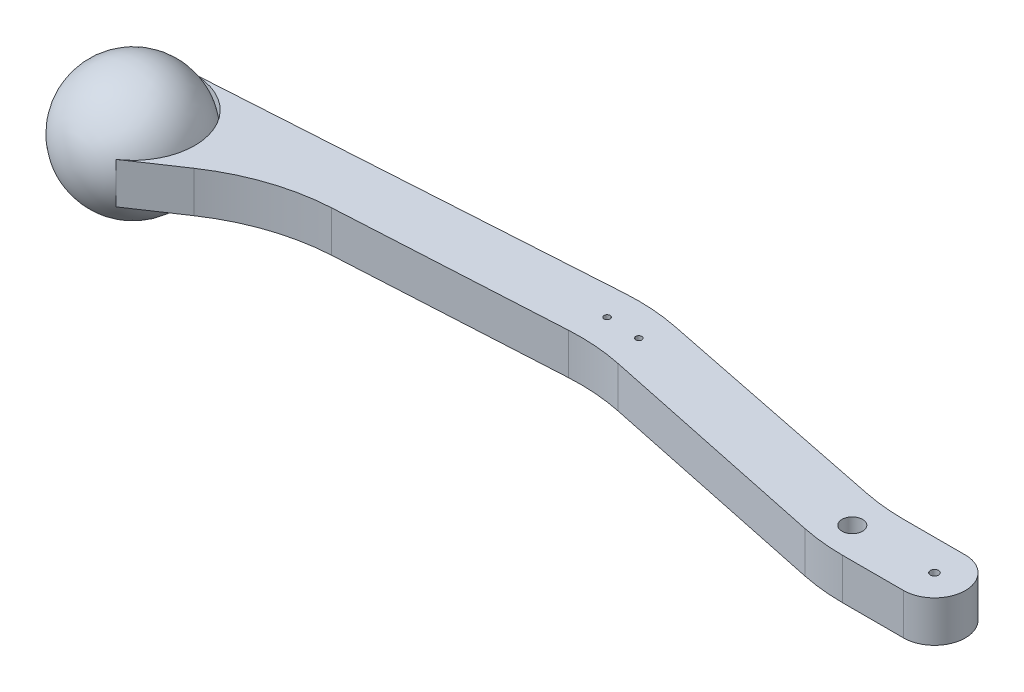
ISO-10303-21;
HEADER;
FILE_DESCRIPTION(('STEP AP214'),'2;1');
FILE_NAME('part.step','',(''),(''),'','','');
FILE_SCHEMA(('AUTOMOTIVE_DESIGN { 1 0 10303 214 1 1 1 1 }'));
ENDSEC;
DATA;
#1=APPLICATION_CONTEXT('core data for automotive mechanical design processes');
#2=APPLICATION_PROTOCOL_DEFINITION('international standard','automotive_design',2000,#1);
#3=PRODUCT_CONTEXT('',#1,'mechanical');
#4=PRODUCT('Part','Part','',(#3));
#5=PRODUCT_RELATED_PRODUCT_CATEGORY('part','',(#4));
#6=PRODUCT_DEFINITION_FORMATION('','',#4);
#7=PRODUCT_DEFINITION_CONTEXT('part definition',#1,'design');
#8=PRODUCT_DEFINITION('design','',#6,#7);
#9=PRODUCT_DEFINITION_SHAPE('','',#8);
#10=(LENGTH_UNIT() NAMED_UNIT(*) SI_UNIT(.MILLI.,.METRE.));
#11=(NAMED_UNIT(*) PLANE_ANGLE_UNIT() SI_UNIT($,.RADIAN.));
#12=(NAMED_UNIT(*) SI_UNIT($,.STERADIAN.) SOLID_ANGLE_UNIT());
#13=UNCERTAINTY_MEASURE_WITH_UNIT(LENGTH_MEASURE(1.E-05),#10,'distance_accuracy_value','');
#14=(GEOMETRIC_REPRESENTATION_CONTEXT(3) GLOBAL_UNCERTAINTY_ASSIGNED_CONTEXT((#13)) GLOBAL_UNIT_ASSIGNED_CONTEXT((#10,
#11,#12)) REPRESENTATION_CONTEXT('',''));
#15=CARTESIAN_POINT('',(0.,0.,0.));
#16=DIRECTION('',(0.,0.,1.));
#17=DIRECTION('',(1.,0.,0.));
#18=AXIS2_PLACEMENT_3D('',#15,#16,#17);
#19=CARTESIAN_POINT('',(-350.,0.,0.));
#20=DIRECTION('',(0.,0.,-1.));
#21=DIRECTION('',(1.,0.,0.));
#22=AXIS2_PLACEMENT_3D('',#19,#20,#21);
#23=SPHERICAL_SURFACE('',#22,30.);
#24=CARTESIAN_POINT('',(-350.,0.,-30.));
#25=VERTEX_POINT('',#24);
#26=VERTEX_LOOP('',#25);
#27=FACE_BOUND('',#26,.T.);
#28=ADVANCED_FACE('F43',(#27),#23,.T.);
#29=CLOSED_SHELL('',(#28));
#30=MANIFOLD_SOLID_BREP('B2',#29);
#31=CARTESIAN_POINT('',(0.,-10.,0.));
#32=DIRECTION('',(0.,1.,0.));
#33=DIRECTION('',(0.,0.,1.));
#34=AXIS2_PLACEMENT_3D('',#31,#32,#33);
#35=PLANE('',#34);
#36=CARTESIAN_POINT('',(40.,-10.,0.));
#37=DIRECTION('',(0.,1.,0.));
#38=DIRECTION('',(0.,0.,1.));
#39=AXIS2_PLACEMENT_3D('',#36,#37,#38);
#40=CIRCLE('',#39,2.);
#41=CARTESIAN_POINT('',(40.,-10.,2.));
#42=VERTEX_POINT('',#41);
#43=EDGE_CURVE('E217',#42,#42,#40,.T.);
#44=ORIENTED_EDGE('',*,*,#43,.T.);
#45=EDGE_LOOP('',(#44));
#46=FACE_BOUND('',#45,.T.);
#47=CARTESIAN_POINT('',(0.,-10.,0.));
#48=DIRECTION('',(0.,1.,0.));
#49=DIRECTION('',(0.,0.,1.));
#50=AXIS2_PLACEMENT_3D('',#47,#48,#49);
#51=CIRCLE('',#50,5.);
#52=CARTESIAN_POINT('',(0.,-10.,5.));
#53=VERTEX_POINT('',#52);
#54=EDGE_CURVE('E214',#53,#53,#51,.T.);
#55=ORIENTED_EDGE('',*,*,#54,.T.);
#56=EDGE_LOOP('',(#55));
#57=FACE_BOUND('',#56,.T.);
#58=CARTESIAN_POINT('',(-350.,-10.,0.));
#59=DIRECTION('',(0.,1.,0.));
#60=DIRECTION('',(0.,0.,1.));
#61=AXIS2_PLACEMENT_3D('',#58,#59,#60);
#62=CIRCLE('',#61,30.0000000000001);
#63=CARTESIAN_POINT('',(-333.28573951652,-10.,24.9125168638253));
#64=VERTEX_POINT('',#63);
#65=CARTESIAN_POINT('',(-351.875417006676,-10.,-29.9413228006224));
#66=VERTEX_POINT('',#65);
#67=EDGE_CURVE('E179',#64,#66,#62,.T.);
#68=ORIENTED_EDGE('',*,*,#67,.T.);
#69=DIRECTION('',(-0.998044093354079,0.,0.0625139002225495));
#70=VECTOR('',#69,1.);
#71=CARTESIAN_POINT('',(-3.24321270903869,-10.,-51.778392904997));
#72=LINE('',#71,#70);
#73=CARTESIAN_POINT('',(-152.924441108368,-10.,-42.4028979347315));
#74=VERTEX_POINT('',#73);
#75=EDGE_CURVE('E164',#74,#66,#72,.T.);
#76=ORIENTED_EDGE('',*,*,#75,.F.);
#77=CARTESIAN_POINT('',(-146.673051086113,-10.,57.4015114006764));
#78=DIRECTION('',(0.,1.,0.));
#79=DIRECTION('',(0.,0.,1.));
#80=AXIS2_PLACEMENT_3D('',#77,#78,#79);
#81=CIRCLE('',#80,100.);
#82=CARTESIAN_POINT('',(-126.880148237604,-10.,-40.6201239500433));
#83=VERTEX_POINT('',#82);
#84=EDGE_CURVE('E235',#74,#83,#81,.F.);
#85=ORIENTED_EDGE('',*,*,#84,.T.);
#86=DIRECTION('',(-0.980216353507197,0.,-0.197929028485096));
#87=VECTOR('',#86,1.);
#88=CARTESIAN_POINT('',(2.91019905832324,-10.,-14.4123614952442));
#89=LINE('',#88,#87);
#90=CARTESIAN_POINT('',(-9.79757945192511,-10.,-16.9783646492803));
#91=VERTEX_POINT('',#90);
#92=EDGE_CURVE('E210',#91,#83,#89,.T.);
#93=ORIENTED_EDGE('',*,*,#92,.F.);
#94=CARTESIAN_POINT('',(9.99532339658448,-10.,-115.));
#95=DIRECTION('',(0.,1.,0.));
#96=DIRECTION('',(0.,0.,1.));
#97=AXIS2_PLACEMENT_3D('',#94,#95,#96);
#98=CIRCLE('',#97,100.);
#99=CARTESIAN_POINT('',(9.99532339658448,-10.,-15.));
#100=VERTEX_POINT('',#99);
#101=EDGE_CURVE('E259',#91,#100,#98,.T.);
#102=ORIENTED_EDGE('',*,*,#101,.T.);
#103=DIRECTION('',(1.,0.,0.));
#104=VECTOR('',#103,1.);
#105=CARTESIAN_POINT('',(0.,-10.,-15.));
#106=LINE('',#105,#104);
#107=CARTESIAN_POINT('',(40.,-10.,-15.));
#108=VERTEX_POINT('',#107);
#109=EDGE_CURVE('E208',#100,#108,#106,.T.);
#110=ORIENTED_EDGE('',*,*,#109,.T.);
#111=CARTESIAN_POINT('',(40.,-10.,0.));
#112=DIRECTION('',(0.,1.,0.));
#113=DIRECTION('',(0.,0.,1.));
#114=AXIS2_PLACEMENT_3D('',#111,#112,#113);
#115=CIRCLE('',#114,15.);
#116=CARTESIAN_POINT('',(40.,-10.,15.));
#117=VERTEX_POINT('',#116);
#118=EDGE_CURVE('E205',#117,#108,#115,.T.);
#119=ORIENTED_EDGE('',*,*,#118,.F.);
#120=DIRECTION('',(1.,0.,0.));
#121=VECTOR('',#120,1.);
#122=CARTESIAN_POINT('',(0.,-10.,15.));
#123=LINE('',#122,#121);
#124=CARTESIAN_POINT('',(10.2526447189393,-10.,15.));
#125=VERTEX_POINT('',#124);
#126=EDGE_CURVE('E203',#125,#117,#123,.T.);
#127=ORIENTED_EDGE('',*,*,#126,.F.);
#128=CARTESIAN_POINT('',(10.2526447189393,-10.,-85.));
#129=DIRECTION('',(0.,1.,0.));
#130=DIRECTION('',(0.,0.,1.));
#131=AXIS2_PLACEMENT_3D('',#128,#129,#130);
#132=CIRCLE('',#131,100.);
#133=CARTESIAN_POINT('',(-10.2447746944077,-10.,12.8767377745772));
#134=VERTEX_POINT('',#133);
#135=EDGE_CURVE('E237',#125,#134,#132,.F.);
#136=ORIENTED_EDGE('',*,*,#135,.T.);
#137=DIRECTION('',(0.978767377745772,0.,0.20497419413347));
#138=VECTOR('',#137,1.);
#139=CARTESIAN_POINT('',(-3.01378585704881,-10.,14.3910568491865));
#140=LINE('',#139,#138);
#141=CARTESIAN_POINT('',(-125.16756201185,-10.,-11.1904780456087));
#142=VERTEX_POINT('',#141);
#143=EDGE_CURVE('E200',#142,#134,#140,.T.);
#144=ORIENTED_EDGE('',*,*,#143,.F.);
#145=CARTESIAN_POINT('',(-145.664981425197,-10.,86.6862597289684));
#146=DIRECTION('',(0.,1.,0.));
#147=DIRECTION('',(0.,0.,1.));
#148=AXIS2_PLACEMENT_3D('',#145,#146,#147);
#149=CIRCLE('',#148,100.);
#150=CARTESIAN_POINT('',(-151.198358450132,-10.,-13.1605316000468));
#151=VERTEX_POINT('',#150);
#152=EDGE_CURVE('E75',#142,#151,#149,.T.);
#153=ORIENTED_EDGE('',*,*,#152,.T.);
#154=DIRECTION('',(0.998467913290153,0.,-0.0553337702493512));
#155=VECTOR('',#154,1.);
#156=CARTESIAN_POINT('',(-1.19004921764275,-10.,-21.4737935567704));
#157=LINE('',#156,#155);
#158=CARTESIAN_POINT('',(-260.427572141376,-10.,-7.1071931457422));
#159=VERTEX_POINT('',#158);
#160=EDGE_CURVE('E198',#159,#151,#157,.T.);
#161=ORIENTED_EDGE('',*,*,#160,.F.);
#162=CARTESIAN_POINT('',(-254.894195116441,-10.,92.7395981832731));
#163=DIRECTION('',(0.,1.,0.));
#164=DIRECTION('',(0.,0.,1.));
#165=AXIS2_PLACEMENT_3D('',#162,#163,#164);
#166=CIRCLE('',#165,100.);
#167=CARTESIAN_POINT('',(-310.608396728041,-10.,9.69787530385566));
#168=VERTEX_POINT('',#167);
#169=EDGE_CURVE('E41',#159,#168,#166,.T.);
#170=ORIENTED_EDGE('',*,*,#169,.T.);
#171=DIRECTION('',(0.830417228794175,0.,-0.557142016116002));
#172=VECTOR('',#171,1.);
#173=CARTESIAN_POINT('',(-91.9282686591511,-10.,-137.018598309922));
#174=LINE('',#173,#172);
#175=EDGE_CURVE('E196',#64,#168,#174,.T.);
#176=ORIENTED_EDGE('',*,*,#175,.F.);
#177=EDGE_LOOP('',(#68,#76,#85,#93,#102,#110,#119,#127,#136,#144,#153,#161,#170,#176));
#178=FACE_BOUND('',#177,.T.);
#179=ADVANCED_FACE('F56',(#46,#57,#178),#35,.F.);
#180=CARTESIAN_POINT('',(0.,10.,0.));
#181=DIRECTION('',(0.,1.,0.));
#182=DIRECTION('',(0.,0.,1.));
#183=AXIS2_PLACEMENT_3D('',#180,#181,#182);
#184=PLANE('',#183);
#185=CARTESIAN_POINT('',(40.,10.,0.));
#186=DIRECTION('',(0.,1.,0.));
#187=DIRECTION('',(0.,0.,1.));
#188=AXIS2_PLACEMENT_3D('',#185,#186,#187);
#189=CIRCLE('',#188,2.);
#190=CARTESIAN_POINT('',(40.,10.,2.));
#191=VERTEX_POINT('',#190);
#192=EDGE_CURVE('E188',#191,#191,#189,.T.);
#193=ORIENTED_EDGE('',*,*,#192,.F.);
#194=EDGE_LOOP('',(#193));
#195=FACE_BOUND('',#194,.T.);
#196=CARTESIAN_POINT('',(0.,10.,0.));
#197=DIRECTION('',(0.,1.,0.));
#198=DIRECTION('',(0.,0.,1.));
#199=AXIS2_PLACEMENT_3D('',#196,#197,#198);
#200=CIRCLE('',#199,5.);
#201=CARTESIAN_POINT('',(0.,10.,5.));
#202=VERTEX_POINT('',#201);
#203=EDGE_CURVE('E184',#202,#202,#200,.T.);
#204=ORIENTED_EDGE('',*,*,#203,.F.);
#205=EDGE_LOOP('',(#204));
#206=FACE_BOUND('',#205,.T.);
#207=CARTESIAN_POINT('',(-147.33624692302,10.,-28.0506034789789));
#208=DIRECTION('',(0.,1.,0.));
#209=DIRECTION('',(0.,0.,1.));
#210=AXIS2_PLACEMENT_3D('',#207,#208,#209);
#211=CIRCLE('',#210,1.5);
#212=CARTESIAN_POINT('',(-147.33624692302,10.,-26.5506034789789));
#213=VERTEX_POINT('',#212);
#214=EDGE_CURVE('E283',#213,#213,#211,.T.);
#215=ORIENTED_EDGE('',*,*,#214,.F.);
#216=EDGE_LOOP('',(#215));
#217=FACE_BOUND('',#216,.T.);
#218=CARTESIAN_POINT('',(-130.791911052962,10.,-26.905656844259));
#219=DIRECTION('',(0.,1.,0.));
#220=DIRECTION('',(0.,0.,1.));
#221=AXIS2_PLACEMENT_3D('',#218,#219,#220);
#222=CIRCLE('',#221,1.50000000000002);
#223=CARTESIAN_POINT('',(-130.791911052962,10.,-25.4056568442589));
#224=VERTEX_POINT('',#223);
#225=EDGE_CURVE('E178',#224,#224,#222,.T.);
#226=ORIENTED_EDGE('',*,*,#225,.F.);
#227=EDGE_LOOP('',(#226));
#228=FACE_BOUND('',#227,.T.);
#229=DIRECTION('',(-0.998044093354079,0.,0.0625139002225495));
#230=VECTOR('',#229,1.);
#231=CARTESIAN_POINT('',(-3.24321270903869,10.,-51.778392904997));
#232=LINE('',#231,#230);
#233=CARTESIAN_POINT('',(-152.924441108368,10.,-42.4028979347315));
#234=VERTEX_POINT('',#233);
#235=CARTESIAN_POINT('',(-351.875417006676,10.,-29.9413228006224));
#236=VERTEX_POINT('',#235);
#237=EDGE_CURVE('E161',#234,#236,#232,.T.);
#238=ORIENTED_EDGE('',*,*,#237,.T.);
#239=CARTESIAN_POINT('',(-350.,10.,0.));
#240=DIRECTION('',(0.,1.,0.));
#241=DIRECTION('',(0.,0.,1.));
#242=AXIS2_PLACEMENT_3D('',#239,#240,#241);
#243=CIRCLE('',#242,30.0000000000001);
#244=CARTESIAN_POINT('',(-333.28573951652,10.,24.9125168638253));
#245=VERTEX_POINT('',#244);
#246=EDGE_CURVE('E171',#245,#236,#243,.T.);
#247=ORIENTED_EDGE('',*,*,#246,.F.);
#248=DIRECTION('',(0.830417228794175,0.,-0.557142016116002));
#249=VECTOR('',#248,1.);
#250=CARTESIAN_POINT('',(-91.9282686591511,10.,-137.018598309922));
#251=LINE('',#250,#249);
#252=CARTESIAN_POINT('',(-310.608396728041,10.,9.69787530385566));
#253=VERTEX_POINT('',#252);
#254=EDGE_CURVE('E266',#245,#253,#251,.T.);
#255=ORIENTED_EDGE('',*,*,#254,.T.);
#256=CARTESIAN_POINT('',(-254.894195116441,10.,92.7395981832731));
#257=DIRECTION('',(0.,1.,0.));
#258=DIRECTION('',(0.,0.,1.));
#259=AXIS2_PLACEMENT_3D('',#256,#257,#258);
#260=CIRCLE('',#259,100.);
#261=CARTESIAN_POINT('',(-260.427572141376,10.,-7.1071931457422));
#262=VERTEX_POINT('',#261);
#263=EDGE_CURVE('E64',#253,#262,#260,.F.);
#264=ORIENTED_EDGE('',*,*,#263,.T.);
#265=DIRECTION('',(0.998467913290153,0.,-0.0553337702493512));
#266=VECTOR('',#265,1.);
#267=CARTESIAN_POINT('',(-1.19004921764275,10.,-21.4737935567704));
#268=LINE('',#267,#266);
#269=CARTESIAN_POINT('',(-151.198358450132,10.,-13.1605316000468));
#270=VERTEX_POINT('',#269);
#271=EDGE_CURVE('E265',#262,#270,#268,.T.);
#272=ORIENTED_EDGE('',*,*,#271,.T.);
#273=CARTESIAN_POINT('',(-145.664981425197,10.,86.6862597289684));
#274=DIRECTION('',(0.,1.,0.));
#275=DIRECTION('',(0.,0.,1.));
#276=AXIS2_PLACEMENT_3D('',#273,#274,#275);
#277=CIRCLE('',#276,100.);
#278=CARTESIAN_POINT('',(-125.16756201185,10.,-11.1904780456087));
#279=VERTEX_POINT('',#278);
#280=EDGE_CURVE('E261',#270,#279,#277,.F.);
#281=ORIENTED_EDGE('',*,*,#280,.T.);
#282=DIRECTION('',(0.978767377745772,0.,0.20497419413347));
#283=VECTOR('',#282,1.);
#284=CARTESIAN_POINT('',(-3.01378585704881,10.,14.3910568491865));
#285=LINE('',#284,#283);
#286=CARTESIAN_POINT('',(-10.2447746944077,10.,12.8767377745772));
#287=VERTEX_POINT('',#286);
#288=EDGE_CURVE('E273',#279,#287,#285,.T.);
#289=ORIENTED_EDGE('',*,*,#288,.T.);
#290=CARTESIAN_POINT('',(10.2526447189393,10.,-85.));
#291=DIRECTION('',(0.,1.,0.));
#292=DIRECTION('',(0.,0.,1.));
#293=AXIS2_PLACEMENT_3D('',#290,#291,#292);
#294=CIRCLE('',#293,100.);
#295=CARTESIAN_POINT('',(10.2526447189393,10.,15.));
#296=VERTEX_POINT('',#295);
#297=EDGE_CURVE('E231',#287,#296,#294,.T.);
#298=ORIENTED_EDGE('',*,*,#297,.T.);
#299=DIRECTION('',(1.,0.,0.));
#300=VECTOR('',#299,1.);
#301=CARTESIAN_POINT('',(0.,10.,15.));
#302=LINE('',#301,#300);
#303=CARTESIAN_POINT('',(40.,10.,15.));
#304=VERTEX_POINT('',#303);
#305=EDGE_CURVE('E294',#296,#304,#302,.T.);
#306=ORIENTED_EDGE('',*,*,#305,.T.);
#307=CARTESIAN_POINT('',(40.,10.,0.));
#308=DIRECTION('',(0.,1.,0.));
#309=DIRECTION('',(0.,0.,1.));
#310=AXIS2_PLACEMENT_3D('',#307,#308,#309);
#311=CIRCLE('',#310,15.);
#312=CARTESIAN_POINT('',(40.,10.,-15.));
#313=VERTEX_POINT('',#312);
#314=EDGE_CURVE('E296',#304,#313,#311,.T.);
#315=ORIENTED_EDGE('',*,*,#314,.T.);
#316=DIRECTION('',(1.,0.,0.));
#317=VECTOR('',#316,1.);
#318=CARTESIAN_POINT('',(0.,10.,-15.));
#319=LINE('',#318,#317);
#320=CARTESIAN_POINT('',(9.99532339658448,10.,-15.));
#321=VERTEX_POINT('',#320);
#322=EDGE_CURVE('E190',#321,#313,#319,.T.);
#323=ORIENTED_EDGE('',*,*,#322,.F.);
#324=CARTESIAN_POINT('',(9.99532339658448,10.,-115.));
#325=DIRECTION('',(0.,1.,0.));
#326=DIRECTION('',(0.,0.,1.));
#327=AXIS2_PLACEMENT_3D('',#324,#325,#326);
#328=CIRCLE('',#327,100.);
#329=CARTESIAN_POINT('',(-9.79757945192511,10.,-16.9783646492803));
#330=VERTEX_POINT('',#329);
#331=EDGE_CURVE('E257',#321,#330,#328,.F.);
#332=ORIENTED_EDGE('',*,*,#331,.T.);
#333=DIRECTION('',(-0.980216353507197,0.,-0.197929028485096));
#334=VECTOR('',#333,1.);
#335=CARTESIAN_POINT('',(2.91019905832324,10.,-14.4123614952442));
#336=LINE('',#335,#334);
#337=CARTESIAN_POINT('',(-126.880148237604,10.,-40.6201239500433));
#338=VERTEX_POINT('',#337);
#339=EDGE_CURVE('E185',#330,#338,#336,.T.);
#340=ORIENTED_EDGE('',*,*,#339,.T.);
#341=CARTESIAN_POINT('',(-146.673051086113,10.,57.4015114006764));
#342=DIRECTION('',(0.,1.,0.));
#343=DIRECTION('',(0.,0.,1.));
#344=AXIS2_PLACEMENT_3D('',#341,#342,#343);
#345=CIRCLE('',#344,100.);
#346=EDGE_CURVE('E183',#338,#234,#345,.T.);
#347=ORIENTED_EDGE('',*,*,#346,.T.);
#348=EDGE_LOOP('',(#238,#247,#255,#264,#272,#281,#289,#298,#306,#315,#323,#332,#340,#347));
#349=FACE_BOUND('',#348,.T.);
#350=ADVANCED_FACE('F181',(#195,#206,#217,#228,#349),#184,.T.);
#351=CARTESIAN_POINT('',(-3.24321270903869,-10.,-51.778392904997));
#352=DIRECTION('',(-0.0625139002225495,0.,-0.998044093354079));
#353=DIRECTION('',(-0.998044093354079,0.,0.0625139002225495));
#354=AXIS2_PLACEMENT_3D('',#351,#352,#353);
#355=PLANE('',#354);
#356=ORIENTED_EDGE('',*,*,#237,.F.);
#357=DIRECTION('',(0.,1.,0.));
#358=VECTOR('',#357,1.);
#359=CARTESIAN_POINT('',(-152.924441108368,-10.,-42.4028979347315));
#360=LINE('',#359,#358);
#361=EDGE_CURVE('E247',#234,#74,#360,.F.);
#362=ORIENTED_EDGE('',*,*,#361,.T.);
#363=ORIENTED_EDGE('',*,*,#75,.T.);
#364=DIRECTION('',(0.,1.,0.));
#365=VECTOR('',#364,1.);
#366=CARTESIAN_POINT('',(-351.875417006676,-10.,-29.9413228006224));
#367=LINE('',#366,#365);
#368=EDGE_CURVE('E157',#66,#236,#367,.T.);
#369=ORIENTED_EDGE('',*,*,#368,.T.);
#370=EDGE_LOOP('',(#356,#362,#363,#369));
#371=FACE_BOUND('',#370,.T.);
#372=ADVANCED_FACE('F159',(#371),#355,.T.);
#373=CARTESIAN_POINT('',(2.91019905832324,-10.,-14.4123614952442));
#374=DIRECTION('',(0.197929028485096,0.,-0.980216353507197));
#375=DIRECTION('',(-0.980216353507197,0.,-0.197929028485096));
#376=AXIS2_PLACEMENT_3D('',#373,#374,#375);
#377=PLANE('',#376);
#378=ORIENTED_EDGE('',*,*,#339,.F.);
#379=DIRECTION('',(0.,1.,0.));
#380=VECTOR('',#379,1.);
#381=CARTESIAN_POINT('',(-9.7975794519251,-10.,-16.9783646492803));
#382=LINE('',#381,#380);
#383=EDGE_CURVE('E245',#330,#91,#382,.F.);
#384=ORIENTED_EDGE('',*,*,#383,.T.);
#385=ORIENTED_EDGE('',*,*,#92,.T.);
#386=DIRECTION('',(0.,1.,0.));
#387=VECTOR('',#386,1.);
#388=CARTESIAN_POINT('',(-126.880148237604,-10.,-40.6201239500433));
#389=LINE('',#388,#387);
#390=EDGE_CURVE('E242',#83,#338,#389,.T.);
#391=ORIENTED_EDGE('',*,*,#390,.T.);
#392=EDGE_LOOP('',(#378,#384,#385,#391));
#393=FACE_BOUND('',#392,.T.);
#394=ADVANCED_FACE('F322',(#393),#377,.T.);
#395=CARTESIAN_POINT('',(0.,-10.,-15.));
#396=DIRECTION('',(0.,0.,1.));
#397=DIRECTION('',(1.,0.,0.));
#398=AXIS2_PLACEMENT_3D('',#395,#396,#397);
#399=PLANE('',#398);
#400=ORIENTED_EDGE('',*,*,#109,.F.);
#401=DIRECTION('',(0.,1.,0.));
#402=VECTOR('',#401,1.);
#403=CARTESIAN_POINT('',(9.99532339658448,-10.,-15.));
#404=LINE('',#403,#402);
#405=EDGE_CURVE('E239',#100,#321,#404,.T.);
#406=ORIENTED_EDGE('',*,*,#405,.T.);
#407=ORIENTED_EDGE('',*,*,#322,.T.);
#408=DIRECTION('',(0.,1.,0.));
#409=VECTOR('',#408,1.);
#410=CARTESIAN_POINT('',(40.,-10.,-15.));
#411=LINE('',#410,#409);
#412=EDGE_CURVE('E168',#108,#313,#411,.T.);
#413=ORIENTED_EDGE('',*,*,#412,.F.);
#414=EDGE_LOOP('',(#400,#406,#407,#413));
#415=FACE_BOUND('',#414,.T.);
#416=ADVANCED_FACE('F302',(#415),#399,.F.);
#417=CARTESIAN_POINT('',(40.,-10.,0.));
#418=DIRECTION('',(0.,1.,0.));
#419=DIRECTION('',(0.,0.,1.));
#420=AXIS2_PLACEMENT_3D('',#417,#418,#419);
#421=CYLINDRICAL_SURFACE('',#420,15.);
#422=ORIENTED_EDGE('',*,*,#412,.T.);
#423=ORIENTED_EDGE('',*,*,#314,.F.);
#424=DIRECTION('',(0.,1.,0.));
#425=VECTOR('',#424,1.);
#426=CARTESIAN_POINT('',(40.,-10.,15.));
#427=LINE('',#426,#425);
#428=EDGE_CURVE('E222',#117,#304,#427,.T.);
#429=ORIENTED_EDGE('',*,*,#428,.F.);
#430=ORIENTED_EDGE('',*,*,#118,.T.);
#431=EDGE_LOOP('',(#422,#423,#429,#430));
#432=FACE_BOUND('',#431,.T.);
#433=ADVANCED_FACE('F306',(#432),#421,.T.);
#434=CARTESIAN_POINT('',(0.,-10.,15.));
#435=DIRECTION('',(0.,0.,1.));
#436=DIRECTION('',(1.,0.,0.));
#437=AXIS2_PLACEMENT_3D('',#434,#435,#436);
#438=PLANE('',#437);
#439=ORIENTED_EDGE('',*,*,#305,.F.);
#440=DIRECTION('',(0.,1.,0.));
#441=VECTOR('',#440,1.);
#442=CARTESIAN_POINT('',(10.2526447189393,-10.,15.));
#443=LINE('',#442,#441);
#444=EDGE_CURVE('E233',#296,#125,#443,.F.);
#445=ORIENTED_EDGE('',*,*,#444,.T.);
#446=ORIENTED_EDGE('',*,*,#126,.T.);
#447=ORIENTED_EDGE('',*,*,#428,.T.);
#448=EDGE_LOOP('',(#439,#445,#446,#447));
#449=FACE_BOUND('',#448,.T.);
#450=ADVANCED_FACE('F312',(#449),#438,.T.);
#451=CARTESIAN_POINT('',(-3.01378585704881,-10.,14.3910568491865));
#452=DIRECTION('',(-0.20497419413347,0.,0.978767377745772));
#453=DIRECTION('',(0.978767377745772,0.,0.20497419413347));
#454=AXIS2_PLACEMENT_3D('',#451,#452,#453);
#455=PLANE('',#454);
#456=ORIENTED_EDGE('',*,*,#143,.T.);
#457=DIRECTION('',(0.,1.,0.));
#458=VECTOR('',#457,1.);
#459=CARTESIAN_POINT('',(-10.2447746944077,-10.,12.8767377745772));
#460=LINE('',#459,#458);
#461=EDGE_CURVE('E227',#134,#287,#460,.T.);
#462=ORIENTED_EDGE('',*,*,#461,.T.);
#463=ORIENTED_EDGE('',*,*,#288,.F.);
#464=DIRECTION('',(0.,1.,0.));
#465=VECTOR('',#464,1.);
#466=CARTESIAN_POINT('',(-125.16756201185,-10.,-11.1904780456087));
#467=LINE('',#466,#465);
#468=EDGE_CURVE('E167',#279,#142,#467,.F.);
#469=ORIENTED_EDGE('',*,*,#468,.T.);
#470=EDGE_LOOP('',(#456,#462,#463,#469));
#471=FACE_BOUND('',#470,.T.);
#472=ADVANCED_FACE('F365',(#471),#455,.T.);
#473=CARTESIAN_POINT('',(-1.19004921764275,-10.,-21.4737935567704));
#474=DIRECTION('',(0.0553337702493512,0.,0.998467913290153));
#475=DIRECTION('',(0.998467913290153,0.,-0.0553337702493512));
#476=AXIS2_PLACEMENT_3D('',#473,#474,#475);
#477=PLANE('',#476);
#478=ORIENTED_EDGE('',*,*,#160,.T.);
#479=DIRECTION('',(0.,1.,0.));
#480=VECTOR('',#479,1.);
#481=CARTESIAN_POINT('',(-151.198358450132,10.,-13.1605316000468));
#482=LINE('',#481,#480);
#483=EDGE_CURVE('E251',#151,#270,#482,.T.);
#484=ORIENTED_EDGE('',*,*,#483,.T.);
#485=ORIENTED_EDGE('',*,*,#271,.F.);
#486=DIRECTION('',(0.,1.,0.));
#487=VECTOR('',#486,1.);
#488=CARTESIAN_POINT('',(-260.427572141376,-10.,-7.10719314574222));
#489=LINE('',#488,#487);
#490=EDGE_CURVE('E249',#262,#159,#489,.F.);
#491=ORIENTED_EDGE('',*,*,#490,.T.);
#492=EDGE_LOOP('',(#478,#484,#485,#491));
#493=FACE_BOUND('',#492,.T.);
#494=ADVANCED_FACE('F271',(#493),#477,.T.);
#495=CARTESIAN_POINT('',(0.,-10.,0.));
#496=DIRECTION('',(0.,1.,0.));
#497=DIRECTION('',(0.,0.,1.));
#498=AXIS2_PLACEMENT_3D('',#495,#496,#497);
#499=CYLINDRICAL_SURFACE('',#498,5.);
#500=ORIENTED_EDGE('',*,*,#54,.F.);
#501=EDGE_LOOP('',(#500));
#502=FACE_BOUND('',#501,.T.);
#503=ORIENTED_EDGE('',*,*,#203,.T.);
#504=EDGE_LOOP('',(#503));
#505=FACE_BOUND('',#504,.T.);
#506=ADVANCED_FACE('F351',(#502,#505),#499,.F.);
#507=CARTESIAN_POINT('',(-91.9282686591511,-10.,-137.018598309922));
#508=DIRECTION('',(0.557142016116002,0.,0.830417228794175));
#509=DIRECTION('',(0.830417228794175,0.,-0.557142016116002));
#510=AXIS2_PLACEMENT_3D('',#507,#508,#509);
#511=PLANE('',#510);
#512=ORIENTED_EDGE('',*,*,#175,.T.);
#513=DIRECTION('',(0.,1.,0.));
#514=VECTOR('',#513,1.);
#515=CARTESIAN_POINT('',(-310.608396728041,10.,9.69787530385563));
#516=LINE('',#515,#514);
#517=EDGE_CURVE('E254',#168,#253,#516,.T.);
#518=ORIENTED_EDGE('',*,*,#517,.T.);
#519=ORIENTED_EDGE('',*,*,#254,.F.);
#520=DIRECTION('',(0.,1.,0.));
#521=VECTOR('',#520,1.);
#522=CARTESIAN_POINT('',(-333.28573951652,-10.,24.9125168638253));
#523=LINE('',#522,#521);
#524=EDGE_CURVE('E174',#64,#245,#523,.T.);
#525=ORIENTED_EDGE('',*,*,#524,.F.);
#526=EDGE_LOOP('',(#512,#518,#519,#525));
#527=FACE_BOUND('',#526,.T.);
#528=ADVANCED_FACE('F276',(#527),#511,.T.);
#529=CARTESIAN_POINT('',(40.,-10.,0.));
#530=DIRECTION('',(0.,1.,0.));
#531=DIRECTION('',(0.,0.,1.));
#532=AXIS2_PLACEMENT_3D('',#529,#530,#531);
#533=CYLINDRICAL_SURFACE('',#532,2.);
#534=ORIENTED_EDGE('',*,*,#43,.F.);
#535=EDGE_LOOP('',(#534));
#536=FACE_BOUND('',#535,.T.);
#537=ORIENTED_EDGE('',*,*,#192,.T.);
#538=EDGE_LOOP('',(#537));
#539=FACE_BOUND('',#538,.T.);
#540=ADVANCED_FACE('F347',(#536,#539),#533,.F.);
#541=CARTESIAN_POINT('',(10.2526447189393,-10.,-85.));
#542=DIRECTION('',(0.,1.,0.));
#543=DIRECTION('',(0.,0.,1.));
#544=AXIS2_PLACEMENT_3D('',#541,#542,#543);
#545=CYLINDRICAL_SURFACE('',#544,100.);
#546=ORIENTED_EDGE('',*,*,#135,.F.);
#547=ORIENTED_EDGE('',*,*,#444,.F.);
#548=ORIENTED_EDGE('',*,*,#297,.F.);
#549=ORIENTED_EDGE('',*,*,#461,.F.);
#550=EDGE_LOOP('',(#546,#547,#548,#549));
#551=FACE_BOUND('',#550,.T.);
#552=ADVANCED_FACE('F334',(#551),#545,.T.);
#553=CARTESIAN_POINT('',(9.99532339658448,-10.,-115.));
#554=DIRECTION('',(0.,1.,0.));
#555=DIRECTION('',(0.,0.,1.));
#556=AXIS2_PLACEMENT_3D('',#553,#554,#555);
#557=CYLINDRICAL_SURFACE('',#556,100.);
#558=ORIENTED_EDGE('',*,*,#101,.F.);
#559=ORIENTED_EDGE('',*,*,#383,.F.);
#560=ORIENTED_EDGE('',*,*,#331,.F.);
#561=ORIENTED_EDGE('',*,*,#405,.F.);
#562=EDGE_LOOP('',(#558,#559,#560,#561));
#563=FACE_BOUND('',#562,.T.);
#564=ADVANCED_FACE('F318',(#563),#557,.F.);
#565=CARTESIAN_POINT('',(-146.673051086113,-10.,57.4015114006764));
#566=DIRECTION('',(0.,1.,0.));
#567=DIRECTION('',(0.,0.,1.));
#568=AXIS2_PLACEMENT_3D('',#565,#566,#567);
#569=CYLINDRICAL_SURFACE('',#568,100.);
#570=ORIENTED_EDGE('',*,*,#84,.F.);
#571=ORIENTED_EDGE('',*,*,#361,.F.);
#572=ORIENTED_EDGE('',*,*,#346,.F.);
#573=ORIENTED_EDGE('',*,*,#390,.F.);
#574=EDGE_LOOP('',(#570,#571,#572,#573));
#575=FACE_BOUND('',#574,.T.);
#576=ADVANCED_FACE('F325',(#575),#569,.T.);
#577=CARTESIAN_POINT('',(-145.664981425197,-10.,86.6862597289684));
#578=DIRECTION('',(0.,-1.,0.));
#579=DIRECTION('',(0.,0.,-1.));
#580=AXIS2_PLACEMENT_3D('',#577,#578,#579);
#581=CYLINDRICAL_SURFACE('',#580,100.);
#582=ORIENTED_EDGE('',*,*,#152,.F.);
#583=ORIENTED_EDGE('',*,*,#468,.F.);
#584=ORIENTED_EDGE('',*,*,#280,.F.);
#585=ORIENTED_EDGE('',*,*,#483,.F.);
#586=EDGE_LOOP('',(#582,#583,#584,#585));
#587=FACE_BOUND('',#586,.T.);
#588=ADVANCED_FACE('F327',(#587),#581,.F.);
#589=CARTESIAN_POINT('',(-254.894195116441,-10.,92.7395981832731));
#590=DIRECTION('',(0.,-1.,0.));
#591=DIRECTION('',(0.,0.,-1.));
#592=AXIS2_PLACEMENT_3D('',#589,#590,#591);
#593=CYLINDRICAL_SURFACE('',#592,100.);
#594=ORIENTED_EDGE('',*,*,#169,.F.);
#595=ORIENTED_EDGE('',*,*,#490,.F.);
#596=ORIENTED_EDGE('',*,*,#263,.F.);
#597=ORIENTED_EDGE('',*,*,#517,.F.);
#598=EDGE_LOOP('',(#594,#595,#596,#597));
#599=FACE_BOUND('',#598,.T.);
#600=ADVANCED_FACE('F58',(#599),#593,.F.);
#601=CARTESIAN_POINT('',(-147.33624692302,0.,-28.0506034789789));
#602=DIRECTION('',(0.,1.,0.));
#603=DIRECTION('',(0.,0.,1.));
#604=AXIS2_PLACEMENT_3D('',#601,#602,#603);
#605=CYLINDRICAL_SURFACE('',#604,1.5);
#606=CARTESIAN_POINT('',(-147.33624692302,0.,-28.0506034789789));
#607=DIRECTION('',(0.,1.,0.));
#608=DIRECTION('',(0.,0.,1.));
#609=AXIS2_PLACEMENT_3D('',#606,#607,#608);
#610=CIRCLE('',#609,1.5);
#611=CARTESIAN_POINT('',(-147.33624692302,0.,-26.5506034789789));
#612=VERTEX_POINT('',#611);
#613=EDGE_CURVE('E286',#612,#612,#610,.T.);
#614=ORIENTED_EDGE('',*,*,#613,.F.);
#615=EDGE_LOOP('',(#614));
#616=FACE_BOUND('',#615,.T.);
#617=ORIENTED_EDGE('',*,*,#214,.T.);
#618=EDGE_LOOP('',(#617));
#619=FACE_BOUND('',#618,.T.);
#620=ADVANCED_FACE('F406',(#616,#619),#605,.F.);
#621=CARTESIAN_POINT('',(-147.33624692302,0.,-28.0506034789789));
#622=DIRECTION('',(0.,1.,0.));
#623=DIRECTION('',(0.,0.,1.));
#624=AXIS2_PLACEMENT_3D('',#621,#622,#623);
#625=PLANE('',#624);
#626=ORIENTED_EDGE('',*,*,#613,.T.);
#627=EDGE_LOOP('',(#626));
#628=FACE_BOUND('',#627,.T.);
#629=ADVANCED_FACE('F414',(#628),#625,.T.);
#630=CARTESIAN_POINT('',(-130.791911052962,0.,-26.905656844259));
#631=DIRECTION('',(0.,1.,0.));
#632=DIRECTION('',(0.,0.,1.));
#633=AXIS2_PLACEMENT_3D('',#630,#631,#632);
#634=CYLINDRICAL_SURFACE('',#633,1.50000000000002);
#635=CARTESIAN_POINT('',(-130.791911052962,0.,-26.905656844259));
#636=DIRECTION('',(0.,1.,0.));
#637=DIRECTION('',(0.,0.,1.));
#638=AXIS2_PLACEMENT_3D('',#635,#636,#637);
#639=CIRCLE('',#638,1.50000000000002);
#640=CARTESIAN_POINT('',(-130.791911052962,0.,-25.4056568442589));
#641=VERTEX_POINT('',#640);
#642=EDGE_CURVE('E280',#641,#641,#639,.T.);
#643=ORIENTED_EDGE('',*,*,#642,.F.);
#644=EDGE_LOOP('',(#643));
#645=FACE_BOUND('',#644,.T.);
#646=ORIENTED_EDGE('',*,*,#225,.T.);
#647=EDGE_LOOP('',(#646));
#648=FACE_BOUND('',#647,.T.);
#649=ADVANCED_FACE('F423',(#645,#648),#634,.F.);
#650=CARTESIAN_POINT('',(-130.791911052962,0.,-26.905656844259));
#651=DIRECTION('',(0.,1.,0.));
#652=DIRECTION('',(0.,0.,1.));
#653=AXIS2_PLACEMENT_3D('',#650,#651,#652);
#654=PLANE('',#653);
#655=ORIENTED_EDGE('',*,*,#642,.T.);
#656=EDGE_LOOP('',(#655));
#657=FACE_BOUND('',#656,.T.);
#658=ADVANCED_FACE('F433',(#657),#654,.T.);
#659=CARTESIAN_POINT('',(-350.,10.,0.));
#660=DIRECTION('',(0.,-1.,0.));
#661=DIRECTION('',(0.,0.,-1.));
#662=AXIS2_PLACEMENT_3D('',#659,#660,#661);
#663=CYLINDRICAL_SURFACE('',#662,30.0000000000001);
#664=ORIENTED_EDGE('',*,*,#246,.T.);
#665=ORIENTED_EDGE('',*,*,#368,.F.);
#666=ORIENTED_EDGE('',*,*,#67,.F.);
#667=ORIENTED_EDGE('',*,*,#524,.T.);
#668=EDGE_LOOP('',(#664,#665,#666,#667));
#669=FACE_BOUND('',#668,.T.);
#670=ADVANCED_FACE('F172',(#669),#663,.F.);
#671=CLOSED_SHELL('',(#179,#350,#372,#394,#416,#433,#450,#472,#494,#506,#528,#540,#552,#564,
#576,#588,#600,#620,#629,#649,#658,#670));
#672=MANIFOLD_SOLID_BREP('B6',#671);
#673=ADVANCED_BREP_SHAPE_REPRESENTATION('',(#18,#30,#672),#14);
#674=SHAPE_DEFINITION_REPRESENTATION(#9,#673);
ENDSEC;
END-ISO-10303-21;
